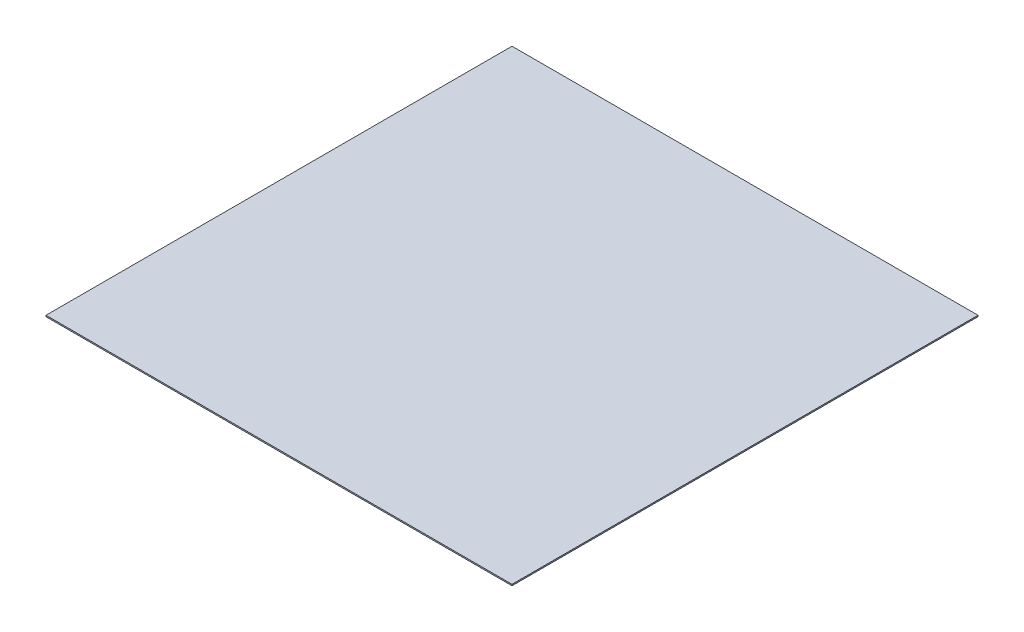
ISO-10303-21;
HEADER;
FILE_DESCRIPTION(('STEP AP214'),'2;1');
FILE_NAME('part.step','',(''),(''),'','','');
FILE_SCHEMA(('AUTOMOTIVE_DESIGN { 1 0 10303 214 1 1 1 1 }'));
ENDSEC;
DATA;
#1=APPLICATION_CONTEXT('core data for automotive mechanical design processes');
#2=APPLICATION_PROTOCOL_DEFINITION('international standard','automotive_design',2000,#1);
#3=PRODUCT_CONTEXT('',#1,'mechanical');
#4=PRODUCT('Part','Part','',(#3));
#5=PRODUCT_RELATED_PRODUCT_CATEGORY('part','',(#4));
#6=PRODUCT_DEFINITION_FORMATION('','',#4);
#7=PRODUCT_DEFINITION_CONTEXT('part definition',#1,'design');
#8=PRODUCT_DEFINITION('design','',#6,#7);
#9=PRODUCT_DEFINITION_SHAPE('','',#8);
#10=(LENGTH_UNIT() NAMED_UNIT(*) SI_UNIT(.MILLI.,.METRE.));
#11=(NAMED_UNIT(*) PLANE_ANGLE_UNIT() SI_UNIT($,.RADIAN.));
#12=(NAMED_UNIT(*) SI_UNIT($,.STERADIAN.) SOLID_ANGLE_UNIT());
#13=UNCERTAINTY_MEASURE_WITH_UNIT(LENGTH_MEASURE(1.E-05),#10,'distance_accuracy_value','');
#14=(GEOMETRIC_REPRESENTATION_CONTEXT(3) GLOBAL_UNCERTAINTY_ASSIGNED_CONTEXT((#13)) GLOBAL_UNIT_ASSIGNED_CONTEXT((#10,
#11,#12)) REPRESENTATION_CONTEXT('',''));
#15=CARTESIAN_POINT('',(0.,0.,0.));
#16=DIRECTION('',(0.,0.,1.));
#17=DIRECTION('',(1.,0.,0.));
#18=AXIS2_PLACEMENT_3D('',#15,#16,#17);
#19=CARTESIAN_POINT('',(0.,0.07,0.));
#20=DIRECTION('',(1.,0.,0.));
#21=DIRECTION('',(0.,0.,-1.));
#22=AXIS2_PLACEMENT_3D('',#19,#20,#21);
#23=PLANE('',#22);
#24=DIRECTION('',(0.,0.,1.));
#25=VECTOR('',#24,1.);
#26=CARTESIAN_POINT('',(0.,0.,0.));
#27=LINE('',#26,#25);
#28=CARTESIAN_POINT('',(0.,0.,-25.));
#29=VERTEX_POINT('',#28);
#30=CARTESIAN_POINT('',(0.,0.,0.));
#31=VERTEX_POINT('',#30);
#32=EDGE_CURVE('E107',#29,#31,#27,.T.);
#33=ORIENTED_EDGE('',*,*,#32,.T.);
#34=DIRECTION('',(0.,-1.,0.));
#35=VECTOR('',#34,1.);
#36=CARTESIAN_POINT('',(0.,0.07,0.));
#37=LINE('',#36,#35);
#38=CARTESIAN_POINT('',(0.,0.07,0.));
#39=VERTEX_POINT('',#38);
#40=EDGE_CURVE('E11',#39,#31,#37,.T.);
#41=ORIENTED_EDGE('',*,*,#40,.F.);
#42=DIRECTION('',(0.,0.,1.));
#43=VECTOR('',#42,1.);
#44=CARTESIAN_POINT('',(0.,0.07,0.));
#45=LINE('',#44,#43);
#46=CARTESIAN_POINT('',(0.,0.07,-25.));
#47=VERTEX_POINT('',#46);
#48=EDGE_CURVE('E91',#47,#39,#45,.T.);
#49=ORIENTED_EDGE('',*,*,#48,.F.);
#50=DIRECTION('',(0.,-1.,0.));
#51=VECTOR('',#50,1.);
#52=CARTESIAN_POINT('',(0.,0.07,-25.));
#53=LINE('',#52,#51);
#54=EDGE_CURVE('E103',#47,#29,#53,.T.);
#55=ORIENTED_EDGE('',*,*,#54,.T.);
#56=EDGE_LOOP('',(#33,#41,#49,#55));
#57=FACE_BOUND('',#56,.T.);
#58=ADVANCED_FACE('F39',(#57),#23,.F.);
#59=CARTESIAN_POINT('',(0.,0.07,0.));
#60=DIRECTION('',(0.,0.,-1.));
#61=DIRECTION('',(-1.,0.,0.));
#62=AXIS2_PLACEMENT_3D('',#59,#60,#61);
#63=PLANE('',#62);
#64=DIRECTION('',(1.,0.,0.));
#65=VECTOR('',#64,1.);
#66=CARTESIAN_POINT('',(0.,0.,0.));
#67=LINE('',#66,#65);
#68=CARTESIAN_POINT('',(25.,0.,0.));
#69=VERTEX_POINT('',#68);
#70=EDGE_CURVE('E96',#31,#69,#67,.T.);
#71=ORIENTED_EDGE('',*,*,#70,.T.);
#72=DIRECTION('',(0.,-1.,0.));
#73=VECTOR('',#72,1.);
#74=CARTESIAN_POINT('',(25.,0.07,0.));
#75=LINE('',#74,#73);
#76=CARTESIAN_POINT('',(25.,0.07,0.));
#77=VERTEX_POINT('',#76);
#78=EDGE_CURVE('E48',#77,#69,#75,.T.);
#79=ORIENTED_EDGE('',*,*,#78,.F.);
#80=DIRECTION('',(1.,0.,0.));
#81=VECTOR('',#80,1.);
#82=CARTESIAN_POINT('',(0.,0.07,0.));
#83=LINE('',#82,#81);
#84=EDGE_CURVE('E86',#39,#77,#83,.T.);
#85=ORIENTED_EDGE('',*,*,#84,.F.);
#86=ORIENTED_EDGE('',*,*,#40,.T.);
#87=EDGE_LOOP('',(#71,#79,#85,#86));
#88=FACE_BOUND('',#87,.T.);
#89=ADVANCED_FACE('F95',(#88),#63,.F.);
#90=CARTESIAN_POINT('',(25.,0.07,0.));
#91=DIRECTION('',(-1.,0.,0.));
#92=DIRECTION('',(0.,0.,1.));
#93=AXIS2_PLACEMENT_3D('',#90,#91,#92);
#94=PLANE('',#93);
#95=DIRECTION('',(0.,0.,-1.));
#96=VECTOR('',#95,1.);
#97=CARTESIAN_POINT('',(25.,0.,0.));
#98=LINE('',#97,#96);
#99=CARTESIAN_POINT('',(25.,0.,-25.));
#100=VERTEX_POINT('',#99);
#101=EDGE_CURVE('E73',#69,#100,#98,.T.);
#102=ORIENTED_EDGE('',*,*,#101,.T.);
#103=DIRECTION('',(0.,-1.,0.));
#104=VECTOR('',#103,1.);
#105=CARTESIAN_POINT('',(25.,0.07,-25.));
#106=LINE('',#105,#104);
#107=CARTESIAN_POINT('',(25.,0.07,-25.));
#108=VERTEX_POINT('',#107);
#109=EDGE_CURVE('E98',#108,#100,#106,.T.);
#110=ORIENTED_EDGE('',*,*,#109,.F.);
#111=DIRECTION('',(0.,0.,-1.));
#112=VECTOR('',#111,1.);
#113=CARTESIAN_POINT('',(25.,0.07,0.));
#114=LINE('',#113,#112);
#115=EDGE_CURVE('E89',#77,#108,#114,.T.);
#116=ORIENTED_EDGE('',*,*,#115,.F.);
#117=ORIENTED_EDGE('',*,*,#78,.T.);
#118=EDGE_LOOP('',(#102,#110,#116,#117));
#119=FACE_BOUND('',#118,.T.);
#120=ADVANCED_FACE('F99',(#119),#94,.F.);
#121=CARTESIAN_POINT('',(0.,0.07,-25.));
#122=DIRECTION('',(0.,0.,1.));
#123=DIRECTION('',(1.,0.,0.));
#124=AXIS2_PLACEMENT_3D('',#121,#122,#123);
#125=PLANE('',#124);
#126=DIRECTION('',(-1.,0.,0.));
#127=VECTOR('',#126,1.);
#128=CARTESIAN_POINT('',(0.,0.,-25.));
#129=LINE('',#128,#127);
#130=EDGE_CURVE('E79',#100,#29,#129,.T.);
#131=ORIENTED_EDGE('',*,*,#130,.T.);
#132=ORIENTED_EDGE('',*,*,#54,.F.);
#133=DIRECTION('',(-1.,0.,0.));
#134=VECTOR('',#133,1.);
#135=CARTESIAN_POINT('',(0.,0.07,-25.));
#136=LINE('',#135,#134);
#137=EDGE_CURVE('E56',#108,#47,#136,.T.);
#138=ORIENTED_EDGE('',*,*,#137,.F.);
#139=ORIENTED_EDGE('',*,*,#109,.T.);
#140=EDGE_LOOP('',(#131,#132,#138,#139));
#141=FACE_BOUND('',#140,.T.);
#142=ADVANCED_FACE('F120',(#141),#125,.F.);
#143=CARTESIAN_POINT('',(0.,0.07,0.));
#144=DIRECTION('',(0.,-1.,0.));
#145=DIRECTION('',(0.,0.,-1.));
#146=AXIS2_PLACEMENT_3D('',#143,#144,#145);
#147=PLANE('',#146);
#148=ORIENTED_EDGE('',*,*,#48,.T.);
#149=ORIENTED_EDGE('',*,*,#84,.T.);
#150=ORIENTED_EDGE('',*,*,#115,.T.);
#151=ORIENTED_EDGE('',*,*,#137,.T.);
#152=EDGE_LOOP('',(#148,#149,#150,#151));
#153=FACE_BOUND('',#152,.T.);
#154=ADVANCED_FACE('F87',(#153),#147,.F.);
#155=CARTESIAN_POINT('',(0.,0.,0.));
#156=DIRECTION('',(0.,-1.,0.));
#157=DIRECTION('',(0.,0.,-1.));
#158=AXIS2_PLACEMENT_3D('',#155,#156,#157);
#159=PLANE('',#158);
#160=ORIENTED_EDGE('',*,*,#32,.F.);
#161=ORIENTED_EDGE('',*,*,#130,.F.);
#162=ORIENTED_EDGE('',*,*,#101,.F.);
#163=ORIENTED_EDGE('',*,*,#70,.F.);
#164=EDGE_LOOP('',(#160,#161,#162,#163));
#165=FACE_BOUND('',#164,.T.);
#166=ADVANCED_FACE('F123',(#165),#159,.T.);
#167=CLOSED_SHELL('',(#58,#89,#120,#142,#154,#166));
#168=MANIFOLD_SOLID_BREP('B2',#167);
#169=ADVANCED_BREP_SHAPE_REPRESENTATION('',(#18,#168),#14);
#170=SHAPE_DEFINITION_REPRESENTATION(#9,#169);
ENDSEC;
END-ISO-10303-21;
